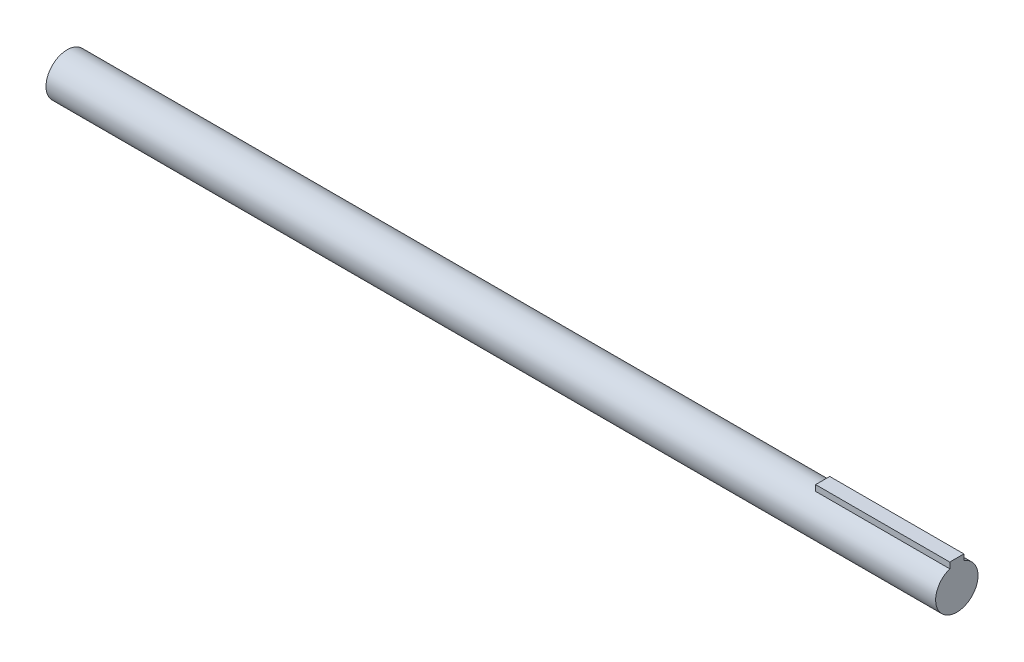
ISO-10303-21;
HEADER;
FILE_DESCRIPTION(('STEP AP214'),'2;1');
FILE_NAME('part.step','',(''),(''),'','','');
FILE_SCHEMA(('AUTOMOTIVE_DESIGN { 1 0 10303 214 1 1 1 1 }'));
ENDSEC;
DATA;
#1=APPLICATION_CONTEXT('core data for automotive mechanical design processes');
#2=APPLICATION_PROTOCOL_DEFINITION('international standard','automotive_design',2000,#1);
#3=PRODUCT_CONTEXT('',#1,'mechanical');
#4=PRODUCT('Part','Part','',(#3));
#5=PRODUCT_RELATED_PRODUCT_CATEGORY('part','',(#4));
#6=PRODUCT_DEFINITION_FORMATION('','',#4);
#7=PRODUCT_DEFINITION_CONTEXT('part definition',#1,'design');
#8=PRODUCT_DEFINITION('design','',#6,#7);
#9=PRODUCT_DEFINITION_SHAPE('','',#8);
#10=(LENGTH_UNIT() NAMED_UNIT(*) SI_UNIT(.MILLI.,.METRE.));
#11=(NAMED_UNIT(*) PLANE_ANGLE_UNIT() SI_UNIT($,.RADIAN.));
#12=(NAMED_UNIT(*) SI_UNIT($,.STERADIAN.) SOLID_ANGLE_UNIT());
#13=UNCERTAINTY_MEASURE_WITH_UNIT(LENGTH_MEASURE(1.E-05),#10,'distance_accuracy_value','');
#14=(GEOMETRIC_REPRESENTATION_CONTEXT(3) GLOBAL_UNCERTAINTY_ASSIGNED_CONTEXT((#13)) GLOBAL_UNIT_ASSIGNED_CONTEXT((#10,
#11,#12)) REPRESENTATION_CONTEXT('',''));
#15=CARTESIAN_POINT('',(0.,0.,0.));
#16=DIRECTION('',(0.,0.,1.));
#17=DIRECTION('',(1.,0.,0.));
#18=AXIS2_PLACEMENT_3D('',#15,#16,#17);
#19=CARTESIAN_POINT('',(590.,0.,0.));
#20=DIRECTION('',(-1.,0.,0.));
#21=DIRECTION('',(0.,0.,1.));
#22=AXIS2_PLACEMENT_3D('',#19,#20,#21);
#23=CYLINDRICAL_SURFACE('',#22,15.);
#24=DIRECTION('',(1.,0.,0.));
#25=VECTOR('',#24,1.);
#26=CARTESIAN_POINT('',(535.,14.142135623731,-5.));
#27=LINE('',#26,#25);
#28=CARTESIAN_POINT('',(535.,14.142135623731,-5.));
#29=VERTEX_POINT('',#28);
#30=CARTESIAN_POINT('',(630.,14.142135623731,-5.));
#31=VERTEX_POINT('',#30);
#32=EDGE_CURVE('E125',#29,#31,#27,.T.);
#33=ORIENTED_EDGE('',*,*,#32,.T.);
#34=CARTESIAN_POINT('',(630.,0.,0.));
#35=DIRECTION('',(1.,0.,0.));
#36=DIRECTION('',(0.,0.,-1.));
#37=AXIS2_PLACEMENT_3D('',#34,#35,#36);
#38=CIRCLE('',#37,15.);
#39=CARTESIAN_POINT('',(630.,14.142135623731,5.));
#40=VERTEX_POINT('',#39);
#41=EDGE_CURVE('E101',#40,#31,#38,.T.);
#42=ORIENTED_EDGE('',*,*,#41,.F.);
#43=DIRECTION('',(1.,0.,0.));
#44=VECTOR('',#43,1.);
#45=CARTESIAN_POINT('',(535.,14.142135623731,5.));
#46=LINE('',#45,#44);
#47=CARTESIAN_POINT('',(535.,14.142135623731,5.));
#48=VERTEX_POINT('',#47);
#49=EDGE_CURVE('E51',#48,#40,#46,.T.);
#50=ORIENTED_EDGE('',*,*,#49,.F.);
#51=CARTESIAN_POINT('',(535.,0.,0.));
#52=DIRECTION('',(-1.,0.,0.));
#53=DIRECTION('',(0.,0.,-1.));
#54=AXIS2_PLACEMENT_3D('',#51,#52,#53);
#55=CIRCLE('',#54,15.);
#56=EDGE_CURVE('E58',#48,#29,#55,.T.);
#57=ORIENTED_EDGE('',*,*,#56,.T.);
#58=EDGE_LOOP('',(#33,#42,#50,#57));
#59=FACE_BOUND('',#58,.T.);
#60=CARTESIAN_POINT('',(0.,0.,0.));
#61=DIRECTION('',(1.,0.,0.));
#62=DIRECTION('',(0.,0.,-1.));
#63=AXIS2_PLACEMENT_3D('',#60,#61,#62);
#64=CIRCLE('',#63,15.);
#65=CARTESIAN_POINT('',(0.,0.,-15.));
#66=VERTEX_POINT('',#65);
#67=EDGE_CURVE('E11',#66,#66,#64,.T.);
#68=ORIENTED_EDGE('',*,*,#67,.T.);
#69=EDGE_LOOP('',(#68));
#70=FACE_BOUND('',#69,.T.);
#71=ADVANCED_FACE('F43',(#59,#70),#23,.T.);
#72=CARTESIAN_POINT('',(0.,0.,0.));
#73=DIRECTION('',(1.,0.,0.));
#74=DIRECTION('',(0.,0.,-1.));
#75=AXIS2_PLACEMENT_3D('',#72,#73,#74);
#76=PLANE('',#75);
#77=ORIENTED_EDGE('',*,*,#67,.F.);
#78=EDGE_LOOP('',(#77));
#79=FACE_BOUND('',#78,.T.);
#80=ADVANCED_FACE('F146',(#79),#76,.F.);
#81=CARTESIAN_POINT('',(535.,18.302135623731,5.));
#82=DIRECTION('',(0.,0.,1.));
#83=DIRECTION('',(1.,0.,0.));
#84=AXIS2_PLACEMENT_3D('',#81,#82,#83);
#85=PLANE('',#84);
#86=ORIENTED_EDGE('',*,*,#49,.T.);
#87=DIRECTION('',(0.,-1.,0.));
#88=VECTOR('',#87,1.);
#89=CARTESIAN_POINT('',(630.,18.302135623731,5.));
#90=LINE('',#89,#88);
#91=CARTESIAN_POINT('',(630.,18.302135623731,5.));
#92=VERTEX_POINT('',#91);
#93=EDGE_CURVE('E94',#92,#40,#90,.T.);
#94=ORIENTED_EDGE('',*,*,#93,.F.);
#95=DIRECTION('',(1.,0.,0.));
#96=VECTOR('',#95,1.);
#97=CARTESIAN_POINT('',(535.,18.302135623731,5.));
#98=LINE('',#97,#96);
#99=CARTESIAN_POINT('',(535.,18.302135623731,5.));
#100=VERTEX_POINT('',#99);
#101=EDGE_CURVE('E65',#100,#92,#98,.T.);
#102=ORIENTED_EDGE('',*,*,#101,.F.);
#103=DIRECTION('',(0.,-1.,0.));
#104=VECTOR('',#103,1.);
#105=CARTESIAN_POINT('',(535.,18.302135623731,5.));
#106=LINE('',#105,#104);
#107=EDGE_CURVE('E122',#100,#48,#106,.T.);
#108=ORIENTED_EDGE('',*,*,#107,.T.);
#109=EDGE_LOOP('',(#86,#94,#102,#108));
#110=FACE_BOUND('',#109,.T.);
#111=ADVANCED_FACE('F95',(#110),#85,.T.);
#112=CARTESIAN_POINT('',(535.,18.302135623731,-5.));
#113=DIRECTION('',(0.,1.,0.));
#114=DIRECTION('',(0.,0.,1.));
#115=AXIS2_PLACEMENT_3D('',#112,#113,#114);
#116=PLANE('',#115);
#117=ORIENTED_EDGE('',*,*,#101,.T.);
#118=DIRECTION('',(0.,0.,1.));
#119=VECTOR('',#118,1.);
#120=CARTESIAN_POINT('',(630.,18.302135623731,-5.));
#121=LINE('',#120,#119);
#122=CARTESIAN_POINT('',(630.,18.302135623731,-5.));
#123=VERTEX_POINT('',#122);
#124=EDGE_CURVE('E87',#123,#92,#121,.T.);
#125=ORIENTED_EDGE('',*,*,#124,.F.);
#126=DIRECTION('',(1.,0.,0.));
#127=VECTOR('',#126,1.);
#128=CARTESIAN_POINT('',(535.,18.302135623731,-5.));
#129=LINE('',#128,#127);
#130=CARTESIAN_POINT('',(535.,18.302135623731,-5.));
#131=VERTEX_POINT('',#130);
#132=EDGE_CURVE('E91',#131,#123,#129,.T.);
#133=ORIENTED_EDGE('',*,*,#132,.F.);
#134=DIRECTION('',(0.,0.,1.));
#135=VECTOR('',#134,1.);
#136=CARTESIAN_POINT('',(535.,18.302135623731,-5.));
#137=LINE('',#136,#135);
#138=EDGE_CURVE('E89',#131,#100,#137,.T.);
#139=ORIENTED_EDGE('',*,*,#138,.T.);
#140=EDGE_LOOP('',(#117,#125,#133,#139));
#141=FACE_BOUND('',#140,.T.);
#142=ADVANCED_FACE('F85',(#141),#116,.T.);
#143=CARTESIAN_POINT('',(535.,14.142135623731,-5.));
#144=DIRECTION('',(0.,0.,-1.));
#145=DIRECTION('',(-1.,0.,0.));
#146=AXIS2_PLACEMENT_3D('',#143,#144,#145);
#147=PLANE('',#146);
#148=ORIENTED_EDGE('',*,*,#132,.T.);
#149=DIRECTION('',(0.,1.,0.));
#150=VECTOR('',#149,1.);
#151=CARTESIAN_POINT('',(630.,14.142135623731,-5.));
#152=LINE('',#151,#150);
#153=EDGE_CURVE('E106',#31,#123,#152,.T.);
#154=ORIENTED_EDGE('',*,*,#153,.F.);
#155=ORIENTED_EDGE('',*,*,#32,.F.);
#156=DIRECTION('',(0.,1.,0.));
#157=VECTOR('',#156,1.);
#158=CARTESIAN_POINT('',(535.,14.142135623731,-5.));
#159=LINE('',#158,#157);
#160=EDGE_CURVE('E116',#29,#131,#159,.T.);
#161=ORIENTED_EDGE('',*,*,#160,.T.);
#162=EDGE_LOOP('',(#148,#154,#155,#161));
#163=FACE_BOUND('',#162,.T.);
#164=ADVANCED_FACE('F133',(#163),#147,.T.);
#165=CARTESIAN_POINT('',(535.,0.,0.));
#166=DIRECTION('',(1.,0.,0.));
#167=DIRECTION('',(0.,0.,-1.));
#168=AXIS2_PLACEMENT_3D('',#165,#166,#167);
#169=PLANE('',#168);
#170=ORIENTED_EDGE('',*,*,#56,.F.);
#171=ORIENTED_EDGE('',*,*,#107,.F.);
#172=ORIENTED_EDGE('',*,*,#138,.F.);
#173=ORIENTED_EDGE('',*,*,#160,.F.);
#174=EDGE_LOOP('',(#170,#171,#172,#173));
#175=FACE_BOUND('',#174,.T.);
#176=ADVANCED_FACE('F134',(#175),#169,.F.);
#177=CARTESIAN_POINT('',(630.,0.,0.));
#178=DIRECTION('',(1.,0.,0.));
#179=DIRECTION('',(0.,0.,-1.));
#180=AXIS2_PLACEMENT_3D('',#177,#178,#179);
#181=PLANE('',#180);
#182=ORIENTED_EDGE('',*,*,#124,.T.);
#183=ORIENTED_EDGE('',*,*,#93,.T.);
#184=ORIENTED_EDGE('',*,*,#41,.T.);
#185=ORIENTED_EDGE('',*,*,#153,.T.);
#186=EDGE_LOOP('',(#182,#183,#184,#185));
#187=FACE_BOUND('',#186,.T.);
#188=ADVANCED_FACE('F104',(#187),#181,.T.);
#189=CLOSED_SHELL('',(#71,#80,#111,#142,#164,#176,#188));
#190=MANIFOLD_SOLID_BREP('B2',#189);
#191=ADVANCED_BREP_SHAPE_REPRESENTATION('',(#18,#190),#14);
#192=SHAPE_DEFINITION_REPRESENTATION(#9,#191);
ENDSEC;
END-ISO-10303-21;
